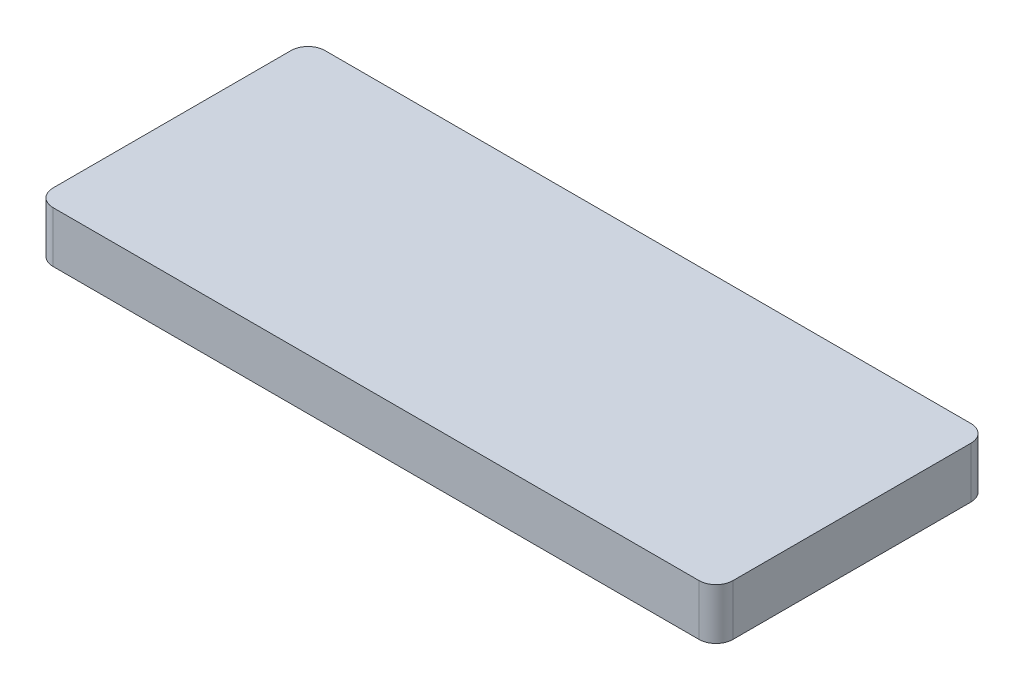
ISO-10303-21;
HEADER;
FILE_DESCRIPTION(('STEP AP214'),'2;1');
FILE_NAME('part.step','',(''),(''),'','','');
FILE_SCHEMA(('AUTOMOTIVE_DESIGN { 1 0 10303 214 1 1 1 1 }'));
ENDSEC;
DATA;
#1=APPLICATION_CONTEXT('core data for automotive mechanical design processes');
#2=APPLICATION_PROTOCOL_DEFINITION('international standard','automotive_design',2000,#1);
#3=PRODUCT_CONTEXT('',#1,'mechanical');
#4=PRODUCT('Part','Part','',(#3));
#5=PRODUCT_RELATED_PRODUCT_CATEGORY('part','',(#4));
#6=PRODUCT_DEFINITION_FORMATION('','',#4);
#7=PRODUCT_DEFINITION_CONTEXT('part definition',#1,'design');
#8=PRODUCT_DEFINITION('design','',#6,#7);
#9=PRODUCT_DEFINITION_SHAPE('','',#8);
#10=(LENGTH_UNIT() NAMED_UNIT(*) SI_UNIT(.MILLI.,.METRE.));
#11=(NAMED_UNIT(*) PLANE_ANGLE_UNIT() SI_UNIT($,.RADIAN.));
#12=(NAMED_UNIT(*) SI_UNIT($,.STERADIAN.) SOLID_ANGLE_UNIT());
#13=UNCERTAINTY_MEASURE_WITH_UNIT(LENGTH_MEASURE(1.E-05),#10,'distance_accuracy_value','');
#14=(GEOMETRIC_REPRESENTATION_CONTEXT(3) GLOBAL_UNCERTAINTY_ASSIGNED_CONTEXT((#13)) GLOBAL_UNIT_ASSIGNED_CONTEXT((#10,
#11,#12)) REPRESENTATION_CONTEXT('',''));
#15=CARTESIAN_POINT('',(0.,0.,0.));
#16=DIRECTION('',(0.,0.,1.));
#17=DIRECTION('',(1.,0.,0.));
#18=AXIS2_PLACEMENT_3D('',#15,#16,#17);
#19=CARTESIAN_POINT('',(100.,7.5,40.));
#20=DIRECTION('',(-1.,0.,0.));
#21=DIRECTION('',(0.,0.,1.));
#22=AXIS2_PLACEMENT_3D('',#19,#20,#21);
#23=PLANE('',#22);
#24=DIRECTION('',(0.,0.,-1.));
#25=VECTOR('',#24,1.);
#26=CARTESIAN_POINT('',(100.,7.5,40.));
#27=LINE('',#26,#25);
#28=CARTESIAN_POINT('',(100.,7.5,35.));
#29=VERTEX_POINT('',#28);
#30=CARTESIAN_POINT('',(100.,7.5,-35.));
#31=VERTEX_POINT('',#30);
#32=EDGE_CURVE('E122',#29,#31,#27,.T.);
#33=ORIENTED_EDGE('',*,*,#32,.F.);
#34=DIRECTION('',(0.,-1.,0.));
#35=VECTOR('',#34,1.);
#36=CARTESIAN_POINT('',(100.,7.5,35.));
#37=LINE('',#36,#35);
#38=CARTESIAN_POINT('',(100.,-7.5,35.));
#39=VERTEX_POINT('',#38);
#40=EDGE_CURVE('E107',#29,#39,#37,.T.);
#41=ORIENTED_EDGE('',*,*,#40,.T.);
#42=DIRECTION('',(0.,0.,-1.));
#43=VECTOR('',#42,1.);
#44=CARTESIAN_POINT('',(100.,-7.5,40.));
#45=LINE('',#44,#43);
#46=CARTESIAN_POINT('',(100.,-7.5,-35.));
#47=VERTEX_POINT('',#46);
#48=EDGE_CURVE('E119',#39,#47,#45,.T.);
#49=ORIENTED_EDGE('',*,*,#48,.T.);
#50=DIRECTION('',(0.,-1.,0.));
#51=VECTOR('',#50,1.);
#52=CARTESIAN_POINT('',(100.,7.5,-35.));
#53=LINE('',#52,#51);
#54=EDGE_CURVE('E124',#47,#31,#53,.F.);
#55=ORIENTED_EDGE('',*,*,#54,.T.);
#56=EDGE_LOOP('',(#33,#41,#49,#55));
#57=FACE_BOUND('',#56,.T.);
#58=ADVANCED_FACE('F37',(#57),#23,.F.);
#59=CARTESIAN_POINT('',(-100.,7.5,-40.));
#60=DIRECTION('',(0.,0.,1.));
#61=DIRECTION('',(1.,0.,0.));
#62=AXIS2_PLACEMENT_3D('',#59,#60,#61);
#63=PLANE('',#62);
#64=DIRECTION('',(-1.,0.,0.));
#65=VECTOR('',#64,1.);
#66=CARTESIAN_POINT('',(-100.,7.5,-40.));
#67=LINE('',#66,#65);
#68=CARTESIAN_POINT('',(95.,7.5,-40.));
#69=VERTEX_POINT('',#68);
#70=CARTESIAN_POINT('',(-95.,7.5,-40.));
#71=VERTEX_POINT('',#70);
#72=EDGE_CURVE('E164',#69,#71,#67,.T.);
#73=ORIENTED_EDGE('',*,*,#72,.F.);
#74=DIRECTION('',(0.,-1.,0.));
#75=VECTOR('',#74,1.);
#76=CARTESIAN_POINT('',(95.,7.5,-40.));
#77=LINE('',#76,#75);
#78=CARTESIAN_POINT('',(95.,-7.5,-40.));
#79=VERTEX_POINT('',#78);
#80=EDGE_CURVE('E157',#69,#79,#77,.T.);
#81=ORIENTED_EDGE('',*,*,#80,.T.);
#82=DIRECTION('',(-1.,0.,0.));
#83=VECTOR('',#82,1.);
#84=CARTESIAN_POINT('',(-100.,-7.5,-40.));
#85=LINE('',#84,#83);
#86=CARTESIAN_POINT('',(-95.,-7.5,-40.));
#87=VERTEX_POINT('',#86);
#88=EDGE_CURVE('E128',#79,#87,#85,.T.);
#89=ORIENTED_EDGE('',*,*,#88,.T.);
#90=DIRECTION('',(0.,-1.,0.));
#91=VECTOR('',#90,1.);
#92=CARTESIAN_POINT('',(-95.,7.5,-40.));
#93=LINE('',#92,#91);
#94=EDGE_CURVE('E155',#87,#71,#93,.F.);
#95=ORIENTED_EDGE('',*,*,#94,.T.);
#96=EDGE_LOOP('',(#73,#81,#89,#95));
#97=FACE_BOUND('',#96,.T.);
#98=ADVANCED_FACE('F162',(#97),#63,.F.);
#99=CARTESIAN_POINT('',(-100.,7.5,40.));
#100=DIRECTION('',(1.,0.,0.));
#101=DIRECTION('',(0.,0.,-1.));
#102=AXIS2_PLACEMENT_3D('',#99,#100,#101);
#103=PLANE('',#102);
#104=DIRECTION('',(0.,0.,1.));
#105=VECTOR('',#104,1.);
#106=CARTESIAN_POINT('',(-100.,7.5,40.));
#107=LINE('',#106,#105);
#108=CARTESIAN_POINT('',(-100.,7.5,-35.));
#109=VERTEX_POINT('',#108);
#110=CARTESIAN_POINT('',(-100.,7.5,35.));
#111=VERTEX_POINT('',#110);
#112=EDGE_CURVE('E172',#109,#111,#107,.T.);
#113=ORIENTED_EDGE('',*,*,#112,.F.);
#114=DIRECTION('',(0.,-1.,0.));
#115=VECTOR('',#114,1.);
#116=CARTESIAN_POINT('',(-100.,7.5,-35.));
#117=LINE('',#116,#115);
#118=CARTESIAN_POINT('',(-100.,-7.5,-35.));
#119=VERTEX_POINT('',#118);
#120=EDGE_CURVE('E11',#109,#119,#117,.T.);
#121=ORIENTED_EDGE('',*,*,#120,.T.);
#122=DIRECTION('',(0.,0.,1.));
#123=VECTOR('',#122,1.);
#124=CARTESIAN_POINT('',(-100.,-7.5,40.));
#125=LINE('',#124,#123);
#126=CARTESIAN_POINT('',(-100.,-7.5,35.));
#127=VERTEX_POINT('',#126);
#128=EDGE_CURVE('E131',#119,#127,#125,.T.);
#129=ORIENTED_EDGE('',*,*,#128,.T.);
#130=DIRECTION('',(0.,-1.,0.));
#131=VECTOR('',#130,1.);
#132=CARTESIAN_POINT('',(-100.,7.5,35.));
#133=LINE('',#132,#131);
#134=EDGE_CURVE('E45',#127,#111,#133,.F.);
#135=ORIENTED_EDGE('',*,*,#134,.T.);
#136=EDGE_LOOP('',(#113,#121,#129,#135));
#137=FACE_BOUND('',#136,.T.);
#138=ADVANCED_FACE('F171',(#137),#103,.F.);
#139=CARTESIAN_POINT('',(-100.,7.5,40.));
#140=DIRECTION('',(0.,0.,-1.));
#141=DIRECTION('',(-1.,0.,0.));
#142=AXIS2_PLACEMENT_3D('',#139,#140,#141);
#143=PLANE('',#142);
#144=DIRECTION('',(1.,0.,0.));
#145=VECTOR('',#144,1.);
#146=CARTESIAN_POINT('',(-100.,-7.5,40.));
#147=LINE('',#146,#145);
#148=CARTESIAN_POINT('',(-95.,-7.5,40.));
#149=VERTEX_POINT('',#148);
#150=CARTESIAN_POINT('',(95.,-7.5,40.));
#151=VERTEX_POINT('',#150);
#152=EDGE_CURVE('E138',#149,#151,#147,.T.);
#153=ORIENTED_EDGE('',*,*,#152,.T.);
#154=DIRECTION('',(0.,-1.,0.));
#155=VECTOR('',#154,1.);
#156=CARTESIAN_POINT('',(95.,7.5,40.));
#157=LINE('',#156,#155);
#158=CARTESIAN_POINT('',(95.,7.5,40.));
#159=VERTEX_POINT('',#158);
#160=EDGE_CURVE('E108',#151,#159,#157,.F.);
#161=ORIENTED_EDGE('',*,*,#160,.T.);
#162=DIRECTION('',(1.,0.,0.));
#163=VECTOR('',#162,1.);
#164=CARTESIAN_POINT('',(-100.,7.5,40.));
#165=LINE('',#164,#163);
#166=CARTESIAN_POINT('',(-95.,7.5,40.));
#167=VERTEX_POINT('',#166);
#168=EDGE_CURVE('E134',#167,#159,#165,.T.);
#169=ORIENTED_EDGE('',*,*,#168,.F.);
#170=DIRECTION('',(0.,-1.,0.));
#171=VECTOR('',#170,1.);
#172=CARTESIAN_POINT('',(-95.,7.5,40.));
#173=LINE('',#172,#171);
#174=EDGE_CURVE('E113',#167,#149,#173,.T.);
#175=ORIENTED_EDGE('',*,*,#174,.T.);
#176=EDGE_LOOP('',(#153,#161,#169,#175));
#177=FACE_BOUND('',#176,.T.);
#178=ADVANCED_FACE('F195',(#177),#143,.F.);
#179=CARTESIAN_POINT('',(0.,7.5,0.));
#180=DIRECTION('',(0.,-1.,0.));
#181=DIRECTION('',(0.,0.,-1.));
#182=AXIS2_PLACEMENT_3D('',#179,#180,#181);
#183=PLANE('',#182);
#184=ORIENTED_EDGE('',*,*,#168,.T.);
#185=CARTESIAN_POINT('',(95.,7.5,35.));
#186=DIRECTION('',(0.,-1.,0.));
#187=DIRECTION('',(0.,0.,-1.));
#188=AXIS2_PLACEMENT_3D('',#185,#186,#187);
#189=CIRCLE('',#188,5.);
#190=EDGE_CURVE('E153',#159,#29,#189,.F.);
#191=ORIENTED_EDGE('',*,*,#190,.T.);
#192=ORIENTED_EDGE('',*,*,#32,.T.);
#193=CARTESIAN_POINT('',(95.,7.5,-35.));
#194=DIRECTION('',(0.,-1.,0.));
#195=DIRECTION('',(0.,0.,-1.));
#196=AXIS2_PLACEMENT_3D('',#193,#194,#195);
#197=CIRCLE('',#196,5.);
#198=EDGE_CURVE('E151',#31,#69,#197,.F.);
#199=ORIENTED_EDGE('',*,*,#198,.T.);
#200=ORIENTED_EDGE('',*,*,#72,.T.);
#201=CARTESIAN_POINT('',(-95.,7.5,-35.));
#202=DIRECTION('',(0.,-1.,0.));
#203=DIRECTION('',(0.,0.,-1.));
#204=AXIS2_PLACEMENT_3D('',#201,#202,#203);
#205=CIRCLE('',#204,5.);
#206=EDGE_CURVE('E58',#71,#109,#205,.F.);
#207=ORIENTED_EDGE('',*,*,#206,.T.);
#208=ORIENTED_EDGE('',*,*,#112,.T.);
#209=CARTESIAN_POINT('',(-95.,7.5,35.));
#210=DIRECTION('',(0.,-1.,0.));
#211=DIRECTION('',(0.,0.,-1.));
#212=AXIS2_PLACEMENT_3D('',#209,#210,#211);
#213=CIRCLE('',#212,5.);
#214=EDGE_CURVE('E148',#111,#167,#213,.F.);
#215=ORIENTED_EDGE('',*,*,#214,.T.);
#216=EDGE_LOOP('',(#184,#191,#192,#199,#200,#207,#208,#215));
#217=FACE_BOUND('',#216,.T.);
#218=ADVANCED_FACE('F177',(#217),#183,.F.);
#219=CARTESIAN_POINT('',(0.,-7.5,0.));
#220=DIRECTION('',(0.,-1.,0.));
#221=DIRECTION('',(0.,0.,-1.));
#222=AXIS2_PLACEMENT_3D('',#219,#220,#221);
#223=PLANE('',#222);
#224=ORIENTED_EDGE('',*,*,#48,.F.);
#225=CARTESIAN_POINT('',(95.,-7.5,35.));
#226=DIRECTION('',(0.,-1.,0.));
#227=DIRECTION('',(0.,0.,-1.));
#228=AXIS2_PLACEMENT_3D('',#225,#226,#227);
#229=CIRCLE('',#228,5.);
#230=EDGE_CURVE('E103',#39,#151,#229,.T.);
#231=ORIENTED_EDGE('',*,*,#230,.T.);
#232=ORIENTED_EDGE('',*,*,#152,.F.);
#233=CARTESIAN_POINT('',(-95.,-7.5,35.));
#234=DIRECTION('',(0.,-1.,0.));
#235=DIRECTION('',(0.,0.,-1.));
#236=AXIS2_PLACEMENT_3D('',#233,#234,#235);
#237=CIRCLE('',#236,5.);
#238=EDGE_CURVE('E123',#149,#127,#237,.T.);
#239=ORIENTED_EDGE('',*,*,#238,.T.);
#240=ORIENTED_EDGE('',*,*,#128,.F.);
#241=CARTESIAN_POINT('',(-95.,-7.5,-35.));
#242=DIRECTION('',(0.,-1.,0.));
#243=DIRECTION('',(0.,0.,-1.));
#244=AXIS2_PLACEMENT_3D('',#241,#242,#243);
#245=CIRCLE('',#244,5.);
#246=EDGE_CURVE('E142',#119,#87,#245,.T.);
#247=ORIENTED_EDGE('',*,*,#246,.T.);
#248=ORIENTED_EDGE('',*,*,#88,.F.);
#249=CARTESIAN_POINT('',(95.,-7.5,-35.));
#250=DIRECTION('',(0.,-1.,0.));
#251=DIRECTION('',(0.,0.,-1.));
#252=AXIS2_PLACEMENT_3D('',#249,#250,#251);
#253=CIRCLE('',#252,5.);
#254=EDGE_CURVE('E114',#79,#47,#253,.T.);
#255=ORIENTED_EDGE('',*,*,#254,.T.);
#256=EDGE_LOOP('',(#224,#231,#232,#239,#240,#247,#248,#255));
#257=FACE_BOUND('',#256,.T.);
#258=ADVANCED_FACE('F126',(#257),#223,.T.);
#259=CARTESIAN_POINT('',(95.,7.5,35.));
#260=DIRECTION('',(0.,-1.,0.));
#261=DIRECTION('',(0.,0.,-1.));
#262=AXIS2_PLACEMENT_3D('',#259,#260,#261);
#263=CYLINDRICAL_SURFACE('',#262,5.);
#264=ORIENTED_EDGE('',*,*,#190,.F.);
#265=ORIENTED_EDGE('',*,*,#160,.F.);
#266=ORIENTED_EDGE('',*,*,#230,.F.);
#267=ORIENTED_EDGE('',*,*,#40,.F.);
#268=EDGE_LOOP('',(#264,#265,#266,#267));
#269=FACE_BOUND('',#268,.T.);
#270=ADVANCED_FACE('F106',(#269),#263,.T.);
#271=CARTESIAN_POINT('',(95.,7.5,-35.));
#272=DIRECTION('',(0.,-1.,0.));
#273=DIRECTION('',(0.,0.,-1.));
#274=AXIS2_PLACEMENT_3D('',#271,#272,#273);
#275=CYLINDRICAL_SURFACE('',#274,5.);
#276=ORIENTED_EDGE('',*,*,#198,.F.);
#277=ORIENTED_EDGE('',*,*,#54,.F.);
#278=ORIENTED_EDGE('',*,*,#254,.F.);
#279=ORIENTED_EDGE('',*,*,#80,.F.);
#280=EDGE_LOOP('',(#276,#277,#278,#279));
#281=FACE_BOUND('',#280,.T.);
#282=ADVANCED_FACE('F178',(#281),#275,.T.);
#283=CARTESIAN_POINT('',(-95.,7.5,-35.));
#284=DIRECTION('',(0.,-1.,0.));
#285=DIRECTION('',(0.,0.,-1.));
#286=AXIS2_PLACEMENT_3D('',#283,#284,#285);
#287=CYLINDRICAL_SURFACE('',#286,5.);
#288=ORIENTED_EDGE('',*,*,#206,.F.);
#289=ORIENTED_EDGE('',*,*,#94,.F.);
#290=ORIENTED_EDGE('',*,*,#246,.F.);
#291=ORIENTED_EDGE('',*,*,#120,.F.);
#292=EDGE_LOOP('',(#288,#289,#290,#291));
#293=FACE_BOUND('',#292,.T.);
#294=ADVANCED_FACE('F170',(#293),#287,.T.);
#295=CARTESIAN_POINT('',(-95.,7.5,35.));
#296=DIRECTION('',(0.,-1.,0.));
#297=DIRECTION('',(0.,0.,-1.));
#298=AXIS2_PLACEMENT_3D('',#295,#296,#297);
#299=CYLINDRICAL_SURFACE('',#298,5.);
#300=ORIENTED_EDGE('',*,*,#214,.F.);
#301=ORIENTED_EDGE('',*,*,#134,.F.);
#302=ORIENTED_EDGE('',*,*,#238,.F.);
#303=ORIENTED_EDGE('',*,*,#174,.F.);
#304=EDGE_LOOP('',(#300,#301,#302,#303));
#305=FACE_BOUND('',#304,.T.);
#306=ADVANCED_FACE('F39',(#305),#299,.T.);
#307=CLOSED_SHELL('',(#58,#98,#138,#178,#218,#258,#270,#282,#294,#306));
#308=MANIFOLD_SOLID_BREP('B2',#307);
#309=ADVANCED_BREP_SHAPE_REPRESENTATION('',(#18,#308),#14);
#310=SHAPE_DEFINITION_REPRESENTATION(#9,#309);
ENDSEC;
END-ISO-10303-21;
